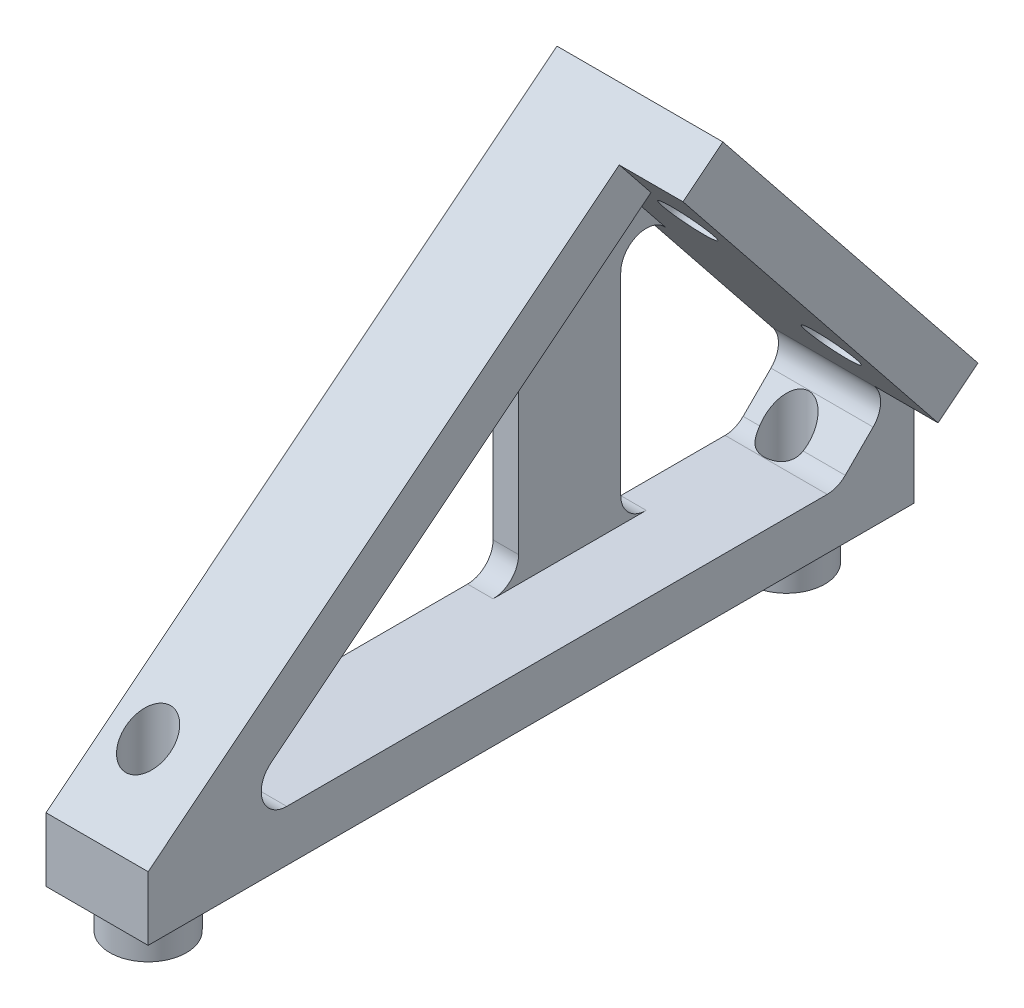
ISO-10303-21;
HEADER;
FILE_DESCRIPTION(('STEP AP214'),'2;1');
FILE_NAME('part.step','',(''),(''),'','','');
FILE_SCHEMA(('AUTOMOTIVE_DESIGN { 1 0 10303 214 1 1 1 1 }'));
ENDSEC;
DATA;
#1=APPLICATION_CONTEXT('core data for automotive mechanical design processes');
#2=APPLICATION_PROTOCOL_DEFINITION('international standard','automotive_design',2000,#1);
#3=PRODUCT_CONTEXT('',#1,'mechanical');
#4=PRODUCT('Part','Part','',(#3));
#5=PRODUCT_RELATED_PRODUCT_CATEGORY('part','',(#4));
#6=PRODUCT_DEFINITION_FORMATION('','',#4);
#7=PRODUCT_DEFINITION_CONTEXT('part definition',#1,'design');
#8=PRODUCT_DEFINITION('design','',#6,#7);
#9=PRODUCT_DEFINITION_SHAPE('','',#8);
#10=(LENGTH_UNIT() NAMED_UNIT(*) SI_UNIT(.MILLI.,.METRE.));
#11=(NAMED_UNIT(*) PLANE_ANGLE_UNIT() SI_UNIT($,.RADIAN.));
#12=(NAMED_UNIT(*) SI_UNIT($,.STERADIAN.) SOLID_ANGLE_UNIT());
#13=UNCERTAINTY_MEASURE_WITH_UNIT(LENGTH_MEASURE(1.E-05),#10,'distance_accuracy_value','');
#14=(GEOMETRIC_REPRESENTATION_CONTEXT(3) GLOBAL_UNCERTAINTY_ASSIGNED_CONTEXT((#13)) GLOBAL_UNIT_ASSIGNED_CONTEXT((#10,
#11,#12)) REPRESENTATION_CONTEXT('',''));
#15=CARTESIAN_POINT('',(0.,0.,0.));
#16=DIRECTION('',(0.,0.,1.));
#17=DIRECTION('',(1.,0.,0.));
#18=AXIS2_PLACEMENT_3D('',#15,#16,#17);
#19=CARTESIAN_POINT('',(13.,4.99999999999999,60.));
#20=DIRECTION('',(0.,-0.781059257272644,-0.624456913348475));
#21=DIRECTION('',(0.,0.624456913348475,-0.781059257272644));
#22=AXIS2_PLACEMENT_3D('',#19,#20,#21);
#23=PLANE('',#22);
#24=CARTESIAN_POINT('',(-10.,8.99750023787564,55.));
#25=DIRECTION('',(0.,-0.781059257272644,-0.624456913348475));
#26=DIRECTION('',(0.,-0.624456913348475,0.781059257272644));
#27=AXIS2_PLACEMENT_3D('',#24,#25,#26);
#28=ELLIPSE('',#27,2.2405470311059,1.75);
#29=CARTESIAN_POINT('',(-10.,7.59837515461916,56.75));
#30=VERTEX_POINT('',#29);
#31=EDGE_CURVE('E497',#30,#30,#28,.T.);
#32=ORIENTED_EDGE('',*,*,#31,.T.);
#33=EDGE_LOOP('',(#32));
#34=FACE_BOUND('',#33,.T.);
#35=DIRECTION('',(0.,-0.624456913348475,0.781059257272644));
#36=VECTOR('',#35,1.);
#37=CARTESIAN_POINT('',(0.,4.99999999999999,60.));
#38=LINE('',#37,#36);
#39=CARTESIAN_POINT('',(0.,36.9938962327247,19.9826212271511));
#40=VERTEX_POINT('',#39);
#41=CARTESIAN_POINT('',(0.,34.4960685793308,23.1068582562417));
#42=VERTEX_POINT('',#41);
#43=EDGE_CURVE('E56',#40,#42,#38,.T.);
#44=ORIENTED_EDGE('',*,*,#43,.F.);
#45=DIRECTION('',(-1.,0.,0.));
#46=VECTOR('',#45,1.);
#47=CARTESIAN_POINT('',(13.,36.9938962327247,19.9826212271511));
#48=LINE('',#47,#46);
#49=CARTESIAN_POINT('',(-13.,36.9938962327247,19.9826212271511));
#50=VERTEX_POINT('',#49);
#51=EDGE_CURVE('E212',#40,#50,#48,.T.);
#52=ORIENTED_EDGE('',*,*,#51,.T.);
#53=DIRECTION('',(0.,-0.624456913348475,0.781059257272644));
#54=VECTOR('',#53,1.);
#55=CARTESIAN_POINT('',(-13.,4.99999999999999,60.));
#56=LINE('',#55,#54);
#57=CARTESIAN_POINT('',(-13.,4.99999999999999,60.));
#58=VERTEX_POINT('',#57);
#59=EDGE_CURVE('E454',#50,#58,#56,.T.);
#60=ORIENTED_EDGE('',*,*,#59,.T.);
#61=DIRECTION('',(1.,0.,0.));
#62=VECTOR('',#61,1.);
#63=CARTESIAN_POINT('',(-13.,4.99999999999999,60.));
#64=LINE('',#63,#62);
#65=CARTESIAN_POINT('',(-5.,5.00000000000001,60.));
#66=VERTEX_POINT('',#65);
#67=EDGE_CURVE('E461',#58,#66,#64,.T.);
#68=ORIENTED_EDGE('',*,*,#67,.T.);
#69=DIRECTION('',(0.,0.624456913348475,-0.781059257272644));
#70=VECTOR('',#69,1.);
#71=CARTESIAN_POINT('',(-5.,34.4960685793308,23.1068582562417));
#72=LINE('',#71,#70);
#73=CARTESIAN_POINT('',(-5.,34.4960685793308,23.1068582562417));
#74=VERTEX_POINT('',#73);
#75=EDGE_CURVE('E432',#66,#74,#72,.T.);
#76=ORIENTED_EDGE('',*,*,#75,.T.);
#77=DIRECTION('',(-1.,0.,0.));
#78=VECTOR('',#77,1.);
#79=CARTESIAN_POINT('',(0.,34.4960685793308,23.1068582562417));
#80=LINE('',#79,#78);
#81=EDGE_CURVE('E36',#42,#74,#80,.T.);
#82=ORIENTED_EDGE('',*,*,#81,.F.);
#83=EDGE_LOOP('',(#44,#52,#60,#68,#76,#82));
#84=FACE_BOUND('',#83,.T.);
#85=ADVANCED_FACE('F32',(#34,#84),#23,.F.);
#86=CARTESIAN_POINT('',(0.,2.18152958615062,-2.72861720617425));
#87=DIRECTION('',(0.,0.624456913348475,-0.781059257272644));
#88=DIRECTION('',(0.,0.781059257272645,0.624456913348475));
#89=AXIS2_PLACEMENT_3D('',#86,#87,#88);
#90=PLANE('',#89);
#91=CARTESIAN_POINT('',(-4.,29.0286537784223,18.7356598628024));
#92=DIRECTION('',(0.,0.624456913348475,-0.781059257272644));
#93=DIRECTION('',(0.,0.781059257272645,0.624456913348475));
#94=AXIS2_PLACEMENT_3D('',#91,#92,#93);
#95=CIRCLE('',#94,2.);
#96=CARTESIAN_POINT('',(-4.,30.5907722929676,19.9845736894993));
#97=VERTEX_POINT('',#96);
#98=EDGE_CURVE('E528',#97,#97,#95,.F.);
#99=ORIENTED_EDGE('',*,*,#98,.F.);
#100=EDGE_LOOP('',(#99));
#101=FACE_BOUND('',#100,.T.);
#102=CARTESIAN_POINT('',(-4.,14.9695871475147,7.49543542252983));
#103=DIRECTION('',(0.,0.624456913348475,-0.781059257272644));
#104=DIRECTION('',(0.,0.781059257272645,0.624456913348475));
#105=AXIS2_PLACEMENT_3D('',#102,#103,#104);
#106=CIRCLE('',#105,2.);
#107=CARTESIAN_POINT('',(-4.,16.53170566206,8.74434924922678));
#108=VERTEX_POINT('',#107);
#109=EDGE_CURVE('E522',#108,#108,#106,.F.);
#110=ORIENTED_EDGE('',*,*,#109,.F.);
#111=EDGE_LOOP('',(#110));
#112=FACE_BOUND('',#111,.T.);
#113=DIRECTION('',(0.,-0.781059257272645,-0.624456913348475));
#114=VECTOR('',#113,1.);
#115=CARTESIAN_POINT('',(0.,2.18152958615062,-2.72861720617425));
#116=LINE('',#115,#114);
#117=CARTESIAN_POINT('',(0.,9.50217234660617,3.12423702909049));
#118=VERTEX_POINT('',#117);
#119=EDGE_CURVE('E49',#42,#118,#116,.T.);
#120=ORIENTED_EDGE('',*,*,#119,.F.);
#121=ORIENTED_EDGE('',*,*,#81,.T.);
#122=DIRECTION('',(0.,0.781059257272644,0.624456913348475));
#123=VECTOR('',#122,1.);
#124=CARTESIAN_POINT('',(-5.,-0.258684667334565,-4.67956861792917));
#125=LINE('',#124,#123);
#126=CARTESIAN_POINT('',(-5.,31.3718315502402,20.6090306028478));
#127=VERTEX_POINT('',#126);
#128=EDGE_CURVE('E435',#127,#74,#125,.T.);
#129=ORIENTED_EDGE('',*,*,#128,.F.);
#130=DIRECTION('',(1.,0.,0.));
#131=VECTOR('',#130,1.);
#132=CARTESIAN_POINT('',(-11.,31.3718315502402,20.6090306028478));
#133=LINE('',#132,#131);
#134=CARTESIAN_POINT('',(-11.,31.3718315502402,20.6090306028478));
#135=VERTEX_POINT('',#134);
#136=EDGE_CURVE('E378',#135,#127,#133,.T.);
#137=ORIENTED_EDGE('',*,*,#136,.F.);
#138=DIRECTION('',(0.,-0.781059257272645,-0.624456913348475));
#139=VECTOR('',#138,1.);
#140=CARTESIAN_POINT('',(-11.,31.3718315502402,20.6090306028478));
#141=LINE('',#140,#139);
#142=CARTESIAN_POINT('',(-11.,22.380552672841,13.4205027126058));
#143=VERTEX_POINT('',#142);
#144=EDGE_CURVE('E408',#135,#143,#141,.T.);
#145=ORIENTED_EDGE('',*,*,#144,.T.);
#146=DIRECTION('',(-1.,0.,0.));
#147=VECTOR('',#146,1.);
#148=CARTESIAN_POINT('',(0.,22.380552672841,13.4205027126058));
#149=LINE('',#148,#147);
#150=CARTESIAN_POINT('',(-13.,22.3805526728409,13.4205027126059));
#151=VERTEX_POINT('',#150);
#152=EDGE_CURVE('E358',#143,#151,#149,.T.);
#153=ORIENTED_EDGE('',*,*,#152,.T.);
#154=DIRECTION('',(0.,0.781059257272647,0.624456913348473));
#155=VECTOR('',#154,1.);
#156=CARTESIAN_POINT('',(-13.,26.83598519639,16.9826212271511));
#157=LINE('',#156,#155);
#158=CARTESIAN_POINT('',(-13.,9.4307271072348,3.0671165568142));
#159=VERTEX_POINT('',#158);
#160=EDGE_CURVE('E405',#159,#151,#157,.T.);
#161=ORIENTED_EDGE('',*,*,#160,.F.);
#162=DIRECTION('',(-1.,0.,0.));
#163=VECTOR('',#162,1.);
#164=CARTESIAN_POINT('',(0.,9.43072710723487,3.06711655681412));
#165=LINE('',#164,#163);
#166=CARTESIAN_POINT('',(-5.,9.43072710723487,3.06711655681412));
#167=VERTEX_POINT('',#166);
#168=EDGE_CURVE('E355',#159,#167,#165,.F.);
#169=ORIENTED_EDGE('',*,*,#168,.T.);
#170=DIRECTION('',(0.,0.781059257272644,0.624456913348475));
#171=VECTOR('',#170,1.);
#172=CARTESIAN_POINT('',(-5.,9.50217234660617,3.12423702909049));
#173=LINE('',#172,#171);
#174=CARTESIAN_POINT('',(-5.,9.50217234660617,3.12423702909049));
#175=VERTEX_POINT('',#174);
#176=EDGE_CURVE('E531',#167,#175,#173,.T.);
#177=ORIENTED_EDGE('',*,*,#176,.T.);
#178=DIRECTION('',(-1.,0.,0.));
#179=VECTOR('',#178,1.);
#180=CARTESIAN_POINT('',(0.,9.50217234660617,3.12423702909049));
#181=LINE('',#180,#179);
#182=EDGE_CURVE('E206',#118,#175,#181,.T.);
#183=ORIENTED_EDGE('',*,*,#182,.F.);
#184=EDGE_LOOP('',(#120,#121,#129,#137,#145,#153,#161,#169,#177,#183));
#185=FACE_BOUND('',#184,.T.);
#186=ADVANCED_FACE('F244',(#101,#112,#185),#90,.F.);
#187=CARTESIAN_POINT('',(13.,36.9938962327247,19.9826212271511));
#188=DIRECTION('',(0.,-0.624456913348472,0.781059257272647));
#189=DIRECTION('',(0.,-0.781059257272647,-0.624456913348472));
#190=AXIS2_PLACEMENT_3D('',#187,#188,#189);
#191=PLANE('',#190);
#192=CARTESIAN_POINT('',(-4.,17.4674148009085,4.37119839343931));
#193=DIRECTION('',(0.,-0.624456913348472,0.781059257272647));
#194=DIRECTION('',(0.,0.781059257272647,0.624456913348472));
#195=AXIS2_PLACEMENT_3D('',#192,#193,#194);
#196=CIRCLE('',#195,2.);
#197=CARTESIAN_POINT('',(-4.,19.0295333154538,5.62011222013625));
#198=VERTEX_POINT('',#197);
#199=EDGE_CURVE('E519',#198,#198,#196,.T.);
#200=ORIENTED_EDGE('',*,*,#199,.T.);
#201=EDGE_LOOP('',(#200));
#202=FACE_BOUND('',#201,.T.);
#203=CARTESIAN_POINT('',(-4.,31.5264814318162,15.6114228337118));
#204=DIRECTION('',(0.,-0.624456913348472,0.781059257272647));
#205=DIRECTION('',(0.,0.781059257272647,0.624456913348472));
#206=AXIS2_PLACEMENT_3D('',#203,#204,#205);
#207=CIRCLE('',#206,2.);
#208=CARTESIAN_POINT('',(-4.,33.0885999463615,16.8603366604088));
#209=VERTEX_POINT('',#208);
#210=EDGE_CURVE('E525',#209,#209,#207,.T.);
#211=ORIENTED_EDGE('',*,*,#210,.T.);
#212=EDGE_LOOP('',(#211));
#213=FACE_BOUND('',#212,.T.);
#214=DIRECTION('',(0.,0.781059257272647,0.624456913348472));
#215=VECTOR('',#214,1.);
#216=CARTESIAN_POINT('',(0.,36.9938962327247,19.9826212271511));
#217=LINE('',#216,#215);
#218=CARTESIAN_POINT('',(0.,12.,0.));
#219=VERTEX_POINT('',#218);
#220=EDGE_CURVE('E209',#219,#40,#217,.T.);
#221=ORIENTED_EDGE('',*,*,#220,.F.);
#222=DIRECTION('',(-1.,0.,0.));
#223=VECTOR('',#222,1.);
#224=CARTESIAN_POINT('',(13.,12.,0.));
#225=LINE('',#224,#223);
#226=CARTESIAN_POINT('',(-5.,12.,0.));
#227=VERTEX_POINT('',#226);
#228=EDGE_CURVE('E198',#219,#227,#225,.T.);
#229=ORIENTED_EDGE('',*,*,#228,.T.);
#230=DIRECTION('',(1.,0.,0.));
#231=VECTOR('',#230,1.);
#232=CARTESIAN_POINT('',(-13.,12.,0.));
#233=LINE('',#232,#231);
#234=CARTESIAN_POINT('',(-13.,12.,0.));
#235=VERTEX_POINT('',#234);
#236=EDGE_CURVE('E459',#235,#227,#233,.T.);
#237=ORIENTED_EDGE('',*,*,#236,.F.);
#238=DIRECTION('',(0.,0.781059257272647,0.624456913348473));
#239=VECTOR('',#238,1.);
#240=CARTESIAN_POINT('',(-13.,36.9938962327247,19.9826212271511));
#241=LINE('',#240,#239);
#242=EDGE_CURVE('E457',#235,#50,#241,.T.);
#243=ORIENTED_EDGE('',*,*,#242,.T.);
#244=ORIENTED_EDGE('',*,*,#51,.F.);
#245=EDGE_LOOP('',(#221,#229,#237,#243,#244));
#246=FACE_BOUND('',#245,.T.);
#247=ADVANCED_FACE('F210',(#202,#213,#246),#191,.F.);
#248=CARTESIAN_POINT('',(0.,17.6201122201363,-7.02953331545388));
#249=DIRECTION('',(0.,0.781059257272644,0.624456913348475));
#250=DIRECTION('',(0.,-0.624456913348475,0.781059257272645));
#251=AXIS2_PLACEMENT_3D('',#248,#249,#250);
#252=PLANE('',#251);
#253=DIRECTION('',(0.,0.624456913348475,-0.781059257272645));
#254=VECTOR('',#253,1.);
#255=CARTESIAN_POINT('',(0.,17.6201122201363,-7.02953331545388));
#256=LINE('',#255,#254);
#257=EDGE_CURVE('E11',#118,#219,#256,.T.);
#258=ORIENTED_EDGE('',*,*,#257,.F.);
#259=ORIENTED_EDGE('',*,*,#182,.T.);
#260=DIRECTION('',(0.,-0.624456913348475,0.781059257272644));
#261=VECTOR('',#260,1.);
#262=CARTESIAN_POINT('',(-5.,17.6201122201363,-7.02953331545388));
#263=LINE('',#262,#261);
#264=EDGE_CURVE('E202',#227,#175,#263,.T.);
#265=ORIENTED_EDGE('',*,*,#264,.F.);
#266=ORIENTED_EDGE('',*,*,#228,.F.);
#267=EDGE_LOOP('',(#258,#259,#265,#266));
#268=FACE_BOUND('',#267,.T.);
#269=ADVANCED_FACE('F200',(#268),#252,.F.);
#270=CARTESIAN_POINT('',(13.,8.03299308645098,1.94962814070017));
#271=DIRECTION('',(0.,0.707106781186546,0.707106781186549));
#272=DIRECTION('',(0.,-0.707106781186549,0.707106781186546));
#273=AXIS2_PLACEMENT_3D('',#270,#271,#272);
#274=PLANE('',#273);
#275=DIRECTION('',(-1.,0.,0.));
#276=VECTOR('',#275,1.);
#277=CARTESIAN_POINT('',(-4.99999999999999,4.58578643762691,5.39683478952422));
#278=LINE('',#277,#276);
#279=CARTESIAN_POINT('',(-13.,4.58578643762691,5.39683478952422));
#280=VERTEX_POINT('',#279);
#281=CARTESIAN_POINT('',(-11.7044125527064,4.58578643762691,5.39683478952422));
#282=VERTEX_POINT('',#281);
#283=EDGE_CURVE('E398',#280,#282,#278,.F.);
#284=ORIENTED_EDGE('',*,*,#283,.T.);
#285=CARTESIAN_POINT('',(-10.,4.98262122715113,5.));
#286=DIRECTION('',(0.,0.707106781186546,0.707106781186549));
#287=DIRECTION('',(0.,-0.707106781186549,0.707106781186546));
#288=AXIS2_PLACEMENT_3D('',#285,#286,#287);
#289=ELLIPSE('',#288,2.47487373415292,1.75);
#290=CARTESIAN_POINT('',(-8.29558744729356,4.58578643762691,5.39683478952422));
#291=VERTEX_POINT('',#290);
#292=EDGE_CURVE('E230',#291,#282,#289,.T.);
#293=ORIENTED_EDGE('',*,*,#292,.F.);
#294=CARTESIAN_POINT('',(-5.,4.5857864376269,5.39683478952422));
#295=VERTEX_POINT('',#294);
#296=EDGE_CURVE('E397',#291,#295,#278,.F.);
#297=ORIENTED_EDGE('',*,*,#296,.T.);
#298=DIRECTION('',(0.,-0.707106781186549,0.707106781186546));
#299=VECTOR('',#298,1.);
#300=CARTESIAN_POINT('',(-5.,7.20175258887286,2.78086863827828));
#301=LINE('',#300,#299);
#302=CARTESIAN_POINT('',(-5.,6.76759971816483,3.21502150898631));
#303=VERTEX_POINT('',#302);
#304=EDGE_CURVE('E426',#303,#295,#301,.T.);
#305=ORIENTED_EDGE('',*,*,#304,.F.);
#306=DIRECTION('',(-1.,0.,0.));
#307=VECTOR('',#306,1.);
#308=CARTESIAN_POINT('',(13.,6.76759971816483,3.21502150898631));
#309=LINE('',#308,#307);
#310=CARTESIAN_POINT('',(-13.,6.76759971816483,3.21502150898631));
#311=VERTEX_POINT('',#310);
#312=EDGE_CURVE('E395',#303,#311,#309,.T.);
#313=ORIENTED_EDGE('',*,*,#312,.T.);
#314=DIRECTION('',(0.,0.707106781186549,-0.707106781186546));
#315=VECTOR('',#314,1.);
#316=CARTESIAN_POINT('',(-13.,8.03299308645098,1.94962814070017));
#317=LINE('',#316,#315);
#318=EDGE_CURVE('E416',#280,#311,#317,.T.);
#319=ORIENTED_EDGE('',*,*,#318,.F.);
#320=EDGE_LOOP('',(#284,#293,#297,#305,#313,#319));
#321=FACE_BOUND('',#320,.T.);
#322=ADVANCED_FACE('F268',(#321),#274,.T.);
#323=CARTESIAN_POINT('',(13.,6.,6.81104835189732));
#324=DIRECTION('',(1.,0.,0.));
#325=DIRECTION('',(0.,0.,-1.));
#326=AXIS2_PLACEMENT_3D('',#323,#324,#325);
#327=CYLINDRICAL_SURFACE('',#326,2.);
#328=CARTESIAN_POINT('',(-8.29558744729357,4.58578643762691,5.39683478952422));
#329=CARTESIAN_POINT('',(-8.30237430661895,4.55661164101087,5.42599705669401));
#330=CARTESIAN_POINT('',(-8.3101440629872,4.52845966389894,5.45596614788278));
#331=CARTESIAN_POINT('',(-8.32787552856729,4.47433109511321,5.51721818331431));
#332=CARTESIAN_POINT('',(-8.33783831463283,4.44835558083984,5.54850176689102));
#333=CARTESIAN_POINT('',(-8.36016681592867,4.39875853940089,5.61202823481423));
#334=CARTESIAN_POINT('',(-8.37253060142761,4.37513514470266,5.64427033127639));
#335=CARTESIAN_POINT('',(-8.39981640747604,4.33032974414087,5.70933824163843));
#336=CARTESIAN_POINT('',(-8.41473788274471,4.30914721950792,5.74216392978662));
#337=CARTESIAN_POINT('',(-8.46366343810198,4.24920551613658,5.84117450638119));
#338=CARTESIAN_POINT('',(-8.5017648877464,4.21419863484478,5.90770197395347));
#339=CARTESIAN_POINT('',(-8.58881665444742,4.15409460210094,6.03787871822795));
#340=CARTESIAN_POINT('',(-8.63775426314733,4.12898593740894,6.10153126213987));
#341=CARTESIAN_POINT('',(-8.74350216882849,4.08815296061411,6.2205780117613));
#342=CARTESIAN_POINT('',(-8.79993935512042,4.07210618746498,6.27619508249403));
#343=CARTESIAN_POINT('',(-8.92071426895098,4.04630316306184,6.37985087354596));
#344=CARTESIAN_POINT('',(-8.98505987372308,4.03655324527456,6.42788192718351));
#345=CARTESIAN_POINT('',(-9.12539899545928,4.02097542416735,6.5182466957784));
#346=CARTESIAN_POINT('',(-9.20191023039846,4.01551502546302,6.5598382946514));
#347=CARTESIAN_POINT('',(-9.36037561583532,4.00777493030205,6.63123958206263));
#348=CARTESIAN_POINT('',(-9.44233073979469,4.00549580432478,6.66104715675276));
#349=CARTESIAN_POINT('',(-9.6178850594171,4.00236214374439,6.71043248567003));
#350=CARTESIAN_POINT('',(-9.71184493469937,4.00166621061397,6.72874630428118));
#351=CARTESIAN_POINT('',(-9.90150386421469,4.00090934014657,6.74983111347046));
#352=CARTESIAN_POINT('',(-9.99720331661837,4.00084855006807,6.75259849952597));
#353=CARTESIAN_POINT('',(-10.1905736334854,4.00117239752009,6.74236178764073));
#354=CARTESIAN_POINT('',(-10.2882203406967,4.00157010890668,6.72889425138387));
#355=CARTESIAN_POINT('',(-10.4798903724145,4.00381147719963,6.68578083318795));
#356=CARTESIAN_POINT('',(-10.5739126767126,4.00565553815566,6.65613043113606));
#357=CARTESIAN_POINT('',(-10.7554011556405,4.01285407123008,6.58160408215308));
#358=CARTESIAN_POINT('',(-10.8428789217916,4.01820216481544,6.53675587189106));
#359=CARTESIAN_POINT('',(-11.0086706078456,4.0352854927421,6.43338963967299));
#360=CARTESIAN_POINT('',(-11.0869896554785,4.04701713209913,6.37487932230388));
#361=CARTESIAN_POINT('',(-11.2278417104107,4.07920223994795,6.25030319701732));
#362=CARTESIAN_POINT('',(-11.2909991178695,4.09915006694277,6.18481663134901));
#363=CARTESIAN_POINT('',(-11.4046938469738,4.1500483356948,6.04750043384971));
#364=CARTESIAN_POINT('',(-11.4552441288865,4.18098739832291,5.97567741967651));
#365=CARTESIAN_POINT('',(-11.53813317093,4.25109451652499,5.83809514862751));
#366=CARTESIAN_POINT('',(-11.57184985816,4.28901153252487,5.77251965955042));
#367=CARTESIAN_POINT('',(-11.6290273104079,4.37450943219301,5.643243510485));
#368=CARTESIAN_POINT('',(-11.6524927648322,4.42208588255184,5.57954200571047));
#369=CARTESIAN_POINT('',(-11.6779672045548,4.49166018617022,5.49740148567358));
#370=CARTESIAN_POINT('',(-11.683922400573,4.50984102509373,5.47681110283486));
#371=CARTESIAN_POINT('',(-11.6948656237311,4.54712393823292,5.43631074064641));
#372=CARTESIAN_POINT('',(-11.6998559577048,4.56622367533618,5.41639923458721));
#373=CARTESIAN_POINT('',(-11.7044125527064,4.58578643762691,5.39683478952422));
#374=B_SPLINE_CURVE_WITH_KNOTS('',3,(#328,#329,#330,#331,#332,#333,#334,#335,#336,#337,#338,
#339,#340,#341,#342,#343,#344,#345,#346,#347,#348,#349,#350,#351,#352,#353,#354,#355,#356,#357,
#358,#359,#360,#361,#362,#363,#364,#365,#366,#367,#368,#369,#370,#371,#372,#373),.UNSPECIFIED.,
.F.,.F.,(4,2,2,2,2,2,2,2,2,2,2,2,2,2,2,2,2,2,2,2,2,2,4),(0.,0.125396432739094,0.250854577382539,
0.376212303030099,0.501543336488006,0.752942043441446,1.00404746375401,1.24553985443084,
1.48727476485899,1.74796569356466,2.0087033644733,2.2945888804682,2.58054067779743,
2.8748521635297,3.16924589689674,3.4631052167421,3.75679921656898,4.03462041417903,
4.31215482017106,4.55968880583115,4.80710943867913,4.89140152674465,4.97548952366149),.UNSPECIFIED.);
#375=EDGE_CURVE('E222',#291,#282,#374,.T.);
#376=ORIENTED_EDGE('',*,*,#375,.T.);
#377=ORIENTED_EDGE('',*,*,#283,.F.);
#378=CARTESIAN_POINT('',(-13.,6.,6.81104835189732));
#379=DIRECTION('',(1.,0.,0.));
#380=DIRECTION('',(0.,0.,-1.));
#381=AXIS2_PLACEMENT_3D('',#378,#379,#380);
#382=CIRCLE('',#381,2.);
#383=CARTESIAN_POINT('',(-13.,4.,6.81104835189732));
#384=VERTEX_POINT('',#383);
#385=EDGE_CURVE('E314',#384,#280,#382,.T.);
#386=ORIENTED_EDGE('',*,*,#385,.F.);
#387=DIRECTION('',(-1.,0.,0.));
#388=VECTOR('',#387,1.);
#389=CARTESIAN_POINT('',(-13.,4.,6.81104835189732));
#390=LINE('',#389,#388);
#391=CARTESIAN_POINT('',(-5.,4.,6.81104835189732));
#392=VERTEX_POINT('',#391);
#393=EDGE_CURVE('E390',#392,#384,#390,.T.);
#394=ORIENTED_EDGE('',*,*,#393,.F.);
#395=CARTESIAN_POINT('',(-5.,6.,6.81104835189732));
#396=DIRECTION('',(1.,0.,0.));
#397=DIRECTION('',(0.,0.,-1.));
#398=AXIS2_PLACEMENT_3D('',#395,#396,#397);
#399=CIRCLE('',#398,2.);
#400=EDGE_CURVE('E321',#295,#392,#399,.F.);
#401=ORIENTED_EDGE('',*,*,#400,.F.);
#402=ORIENTED_EDGE('',*,*,#296,.F.);
#403=EDGE_LOOP('',(#376,#377,#386,#394,#401,#402));
#404=FACE_BOUND('',#403,.T.);
#405=ADVANCED_FACE('F264',(#404),#327,.F.);
#406=CARTESIAN_POINT('',(-10.,-4.,5.));
#407=DIRECTION('',(0.,-1.,0.));
#408=DIRECTION('',(0.,0.,-1.));
#409=AXIS2_PLACEMENT_3D('',#406,#407,#408);
#410=PLANE('',#409);
#411=CARTESIAN_POINT('',(-10.,-4.,5.));
#412=DIRECTION('',(0.,1.,0.));
#413=DIRECTION('',(0.,0.,-1.));
#414=AXIS2_PLACEMENT_3D('',#411,#412,#413);
#415=CIRCLE('',#414,3.);
#416=CARTESIAN_POINT('',(-10.,-4.,2.));
#417=VERTEX_POINT('',#416);
#418=EDGE_CURVE('E491',#417,#417,#415,.T.);
#419=ORIENTED_EDGE('',*,*,#418,.F.);
#420=EDGE_LOOP('',(#419));
#421=FACE_BOUND('',#420,.T.);
#422=CARTESIAN_POINT('',(-10.,-4.,5.));
#423=DIRECTION('',(0.,1.,0.));
#424=DIRECTION('',(0.,0.,-1.));
#425=AXIS2_PLACEMENT_3D('',#422,#423,#424);
#426=CIRCLE('',#425,1.75);
#427=CARTESIAN_POINT('',(-10.,-4.,3.25));
#428=VERTEX_POINT('',#427);
#429=EDGE_CURVE('E217',#428,#428,#426,.T.);
#430=ORIENTED_EDGE('',*,*,#429,.T.);
#431=EDGE_LOOP('',(#430));
#432=FACE_BOUND('',#431,.T.);
#433=ADVANCED_FACE('F267',(#421,#432),#410,.T.);
#434=CARTESIAN_POINT('',(-10.,-4.00000000000001,55.));
#435=DIRECTION('',(0.,-1.,0.));
#436=DIRECTION('',(0.,0.,-1.));
#437=AXIS2_PLACEMENT_3D('',#434,#435,#436);
#438=PLANE('',#437);
#439=CARTESIAN_POINT('',(-10.,-4.00000000000001,55.));
#440=DIRECTION('',(0.,1.,0.));
#441=DIRECTION('',(0.,0.,-1.));
#442=AXIS2_PLACEMENT_3D('',#439,#440,#441);
#443=CIRCLE('',#442,3.);
#444=CARTESIAN_POINT('',(-10.,-4.00000000000001,52.));
#445=VERTEX_POINT('',#444);
#446=EDGE_CURVE('E500',#445,#445,#443,.T.);
#447=ORIENTED_EDGE('',*,*,#446,.F.);
#448=EDGE_LOOP('',(#447));
#449=FACE_BOUND('',#448,.T.);
#450=CARTESIAN_POINT('',(-10.,-4.00000000000001,55.));
#451=DIRECTION('',(0.,1.,0.));
#452=DIRECTION('',(0.,0.,-1.));
#453=AXIS2_PLACEMENT_3D('',#450,#451,#452);
#454=CIRCLE('',#453,1.75);
#455=CARTESIAN_POINT('',(-10.,-4.00000000000001,53.25));
#456=VERTEX_POINT('',#455);
#457=EDGE_CURVE('E492',#456,#456,#454,.T.);
#458=ORIENTED_EDGE('',*,*,#457,.T.);
#459=EDGE_LOOP('',(#458));
#460=FACE_BOUND('',#459,.T.);
#461=ADVANCED_FACE('F572',(#449,#460),#438,.T.);
#462=CARTESIAN_POINT('',(-13.,0.,0.));
#463=DIRECTION('',(0.,-1.,0.));
#464=DIRECTION('',(0.,0.,-1.));
#465=AXIS2_PLACEMENT_3D('',#462,#463,#464);
#466=PLANE('',#465);
#467=DIRECTION('',(0.,0.,-1.));
#468=VECTOR('',#467,1.);
#469=CARTESIAN_POINT('',(-13.,0.,0.));
#470=LINE('',#469,#468);
#471=CARTESIAN_POINT('',(-13.,0.,55.));
#472=VERTEX_POINT('',#471);
#473=CARTESIAN_POINT('',(-13.,0.,5.));
#474=VERTEX_POINT('',#473);
#475=EDGE_CURVE('E451',#472,#474,#470,.T.);
#476=ORIENTED_EDGE('',*,*,#475,.T.);
#477=CARTESIAN_POINT('',(-10.,0.,5.));
#478=DIRECTION('',(0.,1.,0.));
#479=DIRECTION('',(0.,0.,-1.));
#480=AXIS2_PLACEMENT_3D('',#477,#478,#479);
#481=CIRCLE('',#480,3.);
#482=EDGE_CURVE('E489',#474,#474,#481,.T.);
#483=ORIENTED_EDGE('',*,*,#482,.T.);
#484=CARTESIAN_POINT('',(-13.,0.,0.));
#485=VERTEX_POINT('',#484);
#486=EDGE_CURVE('E446',#474,#485,#470,.T.);
#487=ORIENTED_EDGE('',*,*,#486,.T.);
#488=DIRECTION('',(1.,0.,0.));
#489=VECTOR('',#488,1.);
#490=CARTESIAN_POINT('',(-13.,0.,0.));
#491=LINE('',#490,#489);
#492=CARTESIAN_POINT('',(-5.,0.,0.));
#493=VERTEX_POINT('',#492);
#494=EDGE_CURVE('E467',#485,#493,#491,.T.);
#495=ORIENTED_EDGE('',*,*,#494,.T.);
#496=DIRECTION('',(0.,0.,1.));
#497=VECTOR('',#496,1.);
#498=CARTESIAN_POINT('',(-5.,0.,0.));
#499=LINE('',#498,#497);
#500=CARTESIAN_POINT('',(-5.,0.,60.));
#501=VERTEX_POINT('',#500);
#502=EDGE_CURVE('E437',#493,#501,#499,.T.);
#503=ORIENTED_EDGE('',*,*,#502,.T.);
#504=DIRECTION('',(1.,0.,0.));
#505=VECTOR('',#504,1.);
#506=CARTESIAN_POINT('',(-13.,0.,60.));
#507=LINE('',#506,#505);
#508=CARTESIAN_POINT('',(-13.,0.,60.));
#509=VERTEX_POINT('',#508);
#510=EDGE_CURVE('E464',#509,#501,#507,.T.);
#511=ORIENTED_EDGE('',*,*,#510,.F.);
#512=EDGE_CURVE('E447',#509,#472,#470,.T.);
#513=ORIENTED_EDGE('',*,*,#512,.T.);
#514=CARTESIAN_POINT('',(-10.,0.,55.));
#515=DIRECTION('',(0.,1.,0.));
#516=DIRECTION('',(0.,0.,-1.));
#517=AXIS2_PLACEMENT_3D('',#514,#515,#516);
#518=CIRCLE('',#517,3.);
#519=EDGE_CURVE('E484',#472,#472,#518,.T.);
#520=ORIENTED_EDGE('',*,*,#519,.T.);
#521=EDGE_LOOP('',(#476,#483,#487,#495,#503,#511,#513,#520));
#522=FACE_BOUND('',#521,.T.);
#523=ADVANCED_FACE('F483',(#522),#466,.T.);
#524=CARTESIAN_POINT('',(-5.,-0.258684667334565,-4.67956861792917));
#525=DIRECTION('',(1.,0.,0.));
#526=DIRECTION('',(0.,0.,-1.));
#527=AXIS2_PLACEMENT_3D('',#524,#525,#526);
#528=PLANE('',#527);
#529=DIRECTION('',(0.,0.624456913348476,-0.781059257272644));
#530=VECTOR('',#529,1.);
#531=CARTESIAN_POINT('',(-5.,31.3718315502402,20.6090306028478));
#532=LINE('',#531,#530);
#533=CARTESIAN_POINT('',(-5.,7.56211851454527,50.3897830967462));
#534=VERTEX_POINT('',#533);
#535=EDGE_CURVE('E375',#534,#127,#532,.T.);
#536=ORIENTED_EDGE('',*,*,#535,.T.);
#537=ORIENTED_EDGE('',*,*,#128,.T.);
#538=ORIENTED_EDGE('',*,*,#75,.F.);
#539=DIRECTION('',(0.,1.,0.));
#540=VECTOR('',#539,1.);
#541=CARTESIAN_POINT('',(-5.,0.,60.));
#542=LINE('',#541,#540);
#543=EDGE_CURVE('E381',#501,#66,#542,.T.);
#544=ORIENTED_EDGE('',*,*,#543,.F.);
#545=ORIENTED_EDGE('',*,*,#502,.F.);
#546=DIRECTION('',(0.,-1.,0.));
#547=VECTOR('',#546,1.);
#548=CARTESIAN_POINT('',(-5.,12.,0.));
#549=LINE('',#548,#547);
#550=EDGE_CURVE('E440',#227,#493,#549,.T.);
#551=ORIENTED_EDGE('',*,*,#550,.F.);
#552=ORIENTED_EDGE('',*,*,#264,.T.);
#553=ORIENTED_EDGE('',*,*,#176,.F.);
#554=CARTESIAN_POINT('',(-5.,8.18181328053792,4.62923507135941));
#555=DIRECTION('',(1.,0.,0.));
#556=DIRECTION('',(0.,0.,-1.));
#557=AXIS2_PLACEMENT_3D('',#554,#555,#556);
#558=CIRCLE('',#557,2.);
#559=EDGE_CURVE('E325',#167,#303,#558,.F.);
#560=ORIENTED_EDGE('',*,*,#559,.T.);
#561=ORIENTED_EDGE('',*,*,#304,.T.);
#562=ORIENTED_EDGE('',*,*,#400,.T.);
#563=DIRECTION('',(0.,0.,1.));
#564=VECTOR('',#563,1.);
#565=CARTESIAN_POINT('',(-5.,4.,-4.67956861792917));
#566=LINE('',#565,#564);
#567=CARTESIAN_POINT('',(-5.,3.99999999999999,49.1408692700492));
#568=VERTEX_POINT('',#567);
#569=EDGE_CURVE('E351',#392,#568,#566,.T.);
#570=ORIENTED_EDGE('',*,*,#569,.T.);
#571=CARTESIAN_POINT('',(-5.,5.99999999999999,49.1408692700492));
#572=DIRECTION('',(1.,0.,0.));
#573=DIRECTION('',(0.,0.,-1.));
#574=AXIS2_PLACEMENT_3D('',#571,#572,#573);
#575=CIRCLE('',#574,2.);
#576=EDGE_CURVE('E331',#568,#534,#575,.F.);
#577=ORIENTED_EDGE('',*,*,#576,.T.);
#578=EDGE_LOOP('',(#536,#537,#538,#544,#545,#551,#552,#553,#560,#561,#562,#570,#577));
#579=FACE_BOUND('',#578,.T.);
#580=ADVANCED_FACE('F373',(#579),#528,.T.);
#581=CARTESIAN_POINT('',(13.,27.8751456380356,24.9826212271511));
#582=DIRECTION('',(0.,0.,1.));
#583=DIRECTION('',(0.,-1.,0.));
#584=AXIS2_PLACEMENT_3D('',#581,#582,#583);
#585=PLANE('',#584);
#586=DIRECTION('',(-1.,0.,0.));
#587=VECTOR('',#586,1.);
#588=CARTESIAN_POINT('',(-5.,5.99999999999999,24.9826212271511));
#589=LINE('',#588,#587);
#590=CARTESIAN_POINT('',(-13.,6.,24.9826212271511));
#591=VERTEX_POINT('',#590);
#592=CARTESIAN_POINT('',(-11.,5.99999999999999,24.9826212271511));
#593=VERTEX_POINT('',#592);
#594=EDGE_CURVE('E297',#591,#593,#589,.F.);
#595=ORIENTED_EDGE('',*,*,#594,.T.);
#596=DIRECTION('',(0.,1.,0.));
#597=VECTOR('',#596,1.);
#598=CARTESIAN_POINT('',(-11.,27.8751456380356,24.9826212271511));
#599=LINE('',#598,#597);
#600=CARTESIAN_POINT('',(-11.,23.7155203644786,24.9826212271511));
#601=VERTEX_POINT('',#600);
#602=EDGE_CURVE('E307',#593,#601,#599,.T.);
#603=ORIENTED_EDGE('',*,*,#602,.T.);
#604=DIRECTION('',(-1.,0.,0.));
#605=VECTOR('',#604,1.);
#606=CARTESIAN_POINT('',(-13.,23.7155203644786,24.9826212271511));
#607=LINE('',#606,#605);
#608=CARTESIAN_POINT('',(-13.,23.7155203644786,24.9826212271511));
#609=VERTEX_POINT('',#608);
#610=EDGE_CURVE('E312',#601,#609,#607,.T.);
#611=ORIENTED_EDGE('',*,*,#610,.T.);
#612=DIRECTION('',(0.,1.,0.));
#613=VECTOR('',#612,1.);
#614=CARTESIAN_POINT('',(-13.,27.8751456380356,24.9826212271511));
#615=LINE('',#614,#613);
#616=EDGE_CURVE('E310',#591,#609,#615,.T.);
#617=ORIENTED_EDGE('',*,*,#616,.F.);
#618=EDGE_LOOP('',(#595,#603,#611,#617));
#619=FACE_BOUND('',#618,.T.);
#620=ADVANCED_FACE('F306',(#619),#585,.T.);
#621=CARTESIAN_POINT('',(13.,23.7155203644786,26.9826212271511));
#622=DIRECTION('',(1.,0.,0.));
#623=DIRECTION('',(0.,0.,-1.));
#624=AXIS2_PLACEMENT_3D('',#621,#622,#623);
#625=CYLINDRICAL_SURFACE('',#624,2.);
#626=CARTESIAN_POINT('',(-11.,23.7155203644786,26.9826212271511));
#627=DIRECTION('',(1.,0.,0.));
#628=DIRECTION('',(0.,0.,-1.));
#629=AXIS2_PLACEMENT_3D('',#626,#627,#628);
#630=CIRCLE('',#629,2.);
#631=CARTESIAN_POINT('',(-11.,25.2776388790239,28.2315350538481));
#632=VERTEX_POINT('',#631);
#633=EDGE_CURVE('E354',#632,#601,#630,.F.);
#634=ORIENTED_EDGE('',*,*,#633,.F.);
#635=DIRECTION('',(-1.,0.,0.));
#636=VECTOR('',#635,1.);
#637=CARTESIAN_POINT('',(-5.,25.2776388790239,28.2315350538481));
#638=LINE('',#637,#636);
#639=CARTESIAN_POINT('',(-13.,25.2776388790239,28.2315350538481));
#640=VERTEX_POINT('',#639);
#641=EDGE_CURVE('E346',#640,#632,#638,.F.);
#642=ORIENTED_EDGE('',*,*,#641,.F.);
#643=CARTESIAN_POINT('',(-13.,23.7155203644786,26.9826212271511));
#644=DIRECTION('',(1.,0.,0.));
#645=DIRECTION('',(0.,0.,-1.));
#646=AXIS2_PLACEMENT_3D('',#643,#644,#645);
#647=CIRCLE('',#646,2.);
#648=EDGE_CURVE('E301',#609,#640,#647,.T.);
#649=ORIENTED_EDGE('',*,*,#648,.F.);
#650=ORIENTED_EDGE('',*,*,#610,.F.);
#651=EDGE_LOOP('',(#634,#642,#649,#650));
#652=FACE_BOUND('',#651,.T.);
#653=ADVANCED_FACE('F34',(#652),#625,.F.);
#654=CARTESIAN_POINT('',(13.,3.99999999999999,16.9826212271511));
#655=DIRECTION('',(0.,0.,-1.));
#656=DIRECTION('',(-1.,0.,0.));
#657=AXIS2_PLACEMENT_3D('',#654,#655,#656);
#658=PLANE('',#657);
#659=DIRECTION('',(-1.,0.,0.));
#660=VECTOR('',#659,1.);
#661=CARTESIAN_POINT('',(13.,21.131638846144,16.9826212271511));
#662=LINE('',#661,#660);
#663=CARTESIAN_POINT('',(-13.,21.131638846144,16.9826212271511));
#664=VERTEX_POINT('',#663);
#665=CARTESIAN_POINT('',(-11.,21.131638846144,16.9826212271511));
#666=VERTEX_POINT('',#665);
#667=EDGE_CURVE('E380',#664,#666,#662,.F.);
#668=ORIENTED_EDGE('',*,*,#667,.T.);
#669=DIRECTION('',(0.,-1.,0.));
#670=VECTOR('',#669,1.);
#671=CARTESIAN_POINT('',(-11.,3.99999999999999,16.9826212271511));
#672=LINE('',#671,#670);
#673=CARTESIAN_POINT('',(-11.,5.99999999999999,16.9826212271511));
#674=VERTEX_POINT('',#673);
#675=EDGE_CURVE('E514',#666,#674,#672,.T.);
#676=ORIENTED_EDGE('',*,*,#675,.T.);
#677=DIRECTION('',(-1.,0.,0.));
#678=VECTOR('',#677,1.);
#679=CARTESIAN_POINT('',(-13.,5.99999999999999,16.9826212271511));
#680=LINE('',#679,#678);
#681=CARTESIAN_POINT('',(-13.,5.99999999999999,16.9826212271511));
#682=VERTEX_POINT('',#681);
#683=EDGE_CURVE('E384',#674,#682,#680,.T.);
#684=ORIENTED_EDGE('',*,*,#683,.T.);
#685=DIRECTION('',(0.,-1.,0.));
#686=VECTOR('',#685,1.);
#687=CARTESIAN_POINT('',(-13.,3.99999999999999,16.9826212271511));
#688=LINE('',#687,#686);
#689=EDGE_CURVE('E417',#664,#682,#688,.T.);
#690=ORIENTED_EDGE('',*,*,#689,.F.);
#691=EDGE_LOOP('',(#668,#676,#684,#690));
#692=FACE_BOUND('',#691,.T.);
#693=ADVANCED_FACE('F262',(#692),#658,.T.);
#694=CARTESIAN_POINT('',(13.,5.99999999999999,14.9826212271511));
#695=DIRECTION('',(1.,0.,0.));
#696=DIRECTION('',(0.,0.,-1.));
#697=AXIS2_PLACEMENT_3D('',#694,#695,#696);
#698=CYLINDRICAL_SURFACE('',#697,2.);
#699=CARTESIAN_POINT('',(-11.,5.99999999999999,14.9826212271511));
#700=DIRECTION('',(1.,0.,0.));
#701=DIRECTION('',(0.,0.,-1.));
#702=AXIS2_PLACEMENT_3D('',#699,#700,#701);
#703=CIRCLE('',#702,2.);
#704=CARTESIAN_POINT('',(-11.,3.99999999999999,14.9826212271511));
#705=VERTEX_POINT('',#704);
#706=EDGE_CURVE('E517',#705,#674,#703,.F.);
#707=ORIENTED_EDGE('',*,*,#706,.F.);
#708=DIRECTION('',(-1.,0.,0.));
#709=VECTOR('',#708,1.);
#710=CARTESIAN_POINT('',(-5.,3.99999999999999,14.9826212271511));
#711=LINE('',#710,#709);
#712=CARTESIAN_POINT('',(-13.,3.99999999999999,14.9826212271511));
#713=VERTEX_POINT('',#712);
#714=EDGE_CURVE('E392',#713,#705,#711,.F.);
#715=ORIENTED_EDGE('',*,*,#714,.F.);
#716=CARTESIAN_POINT('',(-13.,5.99999999999999,14.9826212271511));
#717=DIRECTION('',(1.,0.,0.));
#718=DIRECTION('',(0.,0.,-1.));
#719=AXIS2_PLACEMENT_3D('',#716,#717,#718);
#720=CIRCLE('',#719,2.);
#721=EDGE_CURVE('E311',#682,#713,#720,.T.);
#722=ORIENTED_EDGE('',*,*,#721,.F.);
#723=ORIENTED_EDGE('',*,*,#683,.F.);
#724=EDGE_LOOP('',(#707,#715,#722,#723));
#725=FACE_BOUND('',#724,.T.);
#726=ADVANCED_FACE('F258',(#725),#698,.F.);
#727=CARTESIAN_POINT('',(0.,21.131638846144,14.9826212271511));
#728=DIRECTION('',(-1.,0.,0.));
#729=DIRECTION('',(0.,0.,1.));
#730=AXIS2_PLACEMENT_3D('',#727,#728,#729);
#731=CYLINDRICAL_SURFACE('',#730,2.);
#732=CARTESIAN_POINT('',(-11.,21.131638846144,14.9826212271511));
#733=DIRECTION('',(1.,0.,0.));
#734=DIRECTION('',(0.,0.,-1.));
#735=AXIS2_PLACEMENT_3D('',#732,#733,#734);
#736=CIRCLE('',#735,2.);
#737=EDGE_CURVE('E512',#666,#143,#736,.F.);
#738=ORIENTED_EDGE('',*,*,#737,.F.);
#739=ORIENTED_EDGE('',*,*,#667,.F.);
#740=CARTESIAN_POINT('',(-13.,21.131638846144,14.9826212271511));
#741=DIRECTION('',(1.,0.,0.));
#742=DIRECTION('',(0.,0.,-1.));
#743=AXIS2_PLACEMENT_3D('',#740,#741,#742);
#744=CIRCLE('',#743,2.);
#745=EDGE_CURVE('E327',#151,#664,#744,.T.);
#746=ORIENTED_EDGE('',*,*,#745,.F.);
#747=ORIENTED_EDGE('',*,*,#152,.F.);
#748=EDGE_LOOP('',(#738,#739,#746,#747));
#749=FACE_BOUND('',#748,.T.);
#750=ADVANCED_FACE('F261',(#749),#731,.F.);
#751=CARTESIAN_POINT('',(13.,5.99999999999999,26.9826212271511));
#752=DIRECTION('',(1.,0.,0.));
#753=DIRECTION('',(0.,0.,-1.));
#754=AXIS2_PLACEMENT_3D('',#751,#752,#753);
#755=CYLINDRICAL_SURFACE('',#754,2.);
#756=CARTESIAN_POINT('',(-11.,5.99999999999999,26.9826212271511));
#757=DIRECTION('',(1.,0.,0.));
#758=DIRECTION('',(0.,0.,-1.));
#759=AXIS2_PLACEMENT_3D('',#756,#757,#758);
#760=CIRCLE('',#759,2.);
#761=CARTESIAN_POINT('',(-11.,3.99999999999999,26.9826212271511));
#762=VERTEX_POINT('',#761);
#763=EDGE_CURVE('E42',#593,#762,#760,.F.);
#764=ORIENTED_EDGE('',*,*,#763,.F.);
#765=ORIENTED_EDGE('',*,*,#594,.F.);
#766=CARTESIAN_POINT('',(-13.,5.99999999999999,26.9826212271511));
#767=DIRECTION('',(1.,0.,0.));
#768=DIRECTION('',(0.,0.,-1.));
#769=AXIS2_PLACEMENT_3D('',#766,#767,#768);
#770=CIRCLE('',#769,2.);
#771=CARTESIAN_POINT('',(-13.,3.99999999999999,26.9826212271511));
#772=VERTEX_POINT('',#771);
#773=EDGE_CURVE('E333',#772,#591,#770,.T.);
#774=ORIENTED_EDGE('',*,*,#773,.F.);
#775=DIRECTION('',(-1.,0.,0.));
#776=VECTOR('',#775,1.);
#777=CARTESIAN_POINT('',(-13.,3.99999999999999,26.9826212271511));
#778=LINE('',#777,#776);
#779=EDGE_CURVE('E298',#762,#772,#778,.T.);
#780=ORIENTED_EDGE('',*,*,#779,.F.);
#781=EDGE_LOOP('',(#764,#765,#774,#780));
#782=FACE_BOUND('',#781,.T.);
#783=ADVANCED_FACE('F278',(#782),#755,.F.);
#784=CARTESIAN_POINT('',(-4.,23.408541558286,25.7651931782562));
#785=DIRECTION('',(0.,0.624456913348472,-0.781059257272647));
#786=DIRECTION('',(0.,0.781059257272647,0.624456913348472));
#787=AXIS2_PLACEMENT_3D('',#784,#785,#786);
#788=CYLINDRICAL_SURFACE('',#787,2.);
#789=ORIENTED_EDGE('',*,*,#210,.F.);
#790=EDGE_LOOP('',(#789));
#791=FACE_BOUND('',#790,.T.);
#792=ORIENTED_EDGE('',*,*,#98,.T.);
#793=EDGE_LOOP('',(#792));
#794=FACE_BOUND('',#793,.T.);
#795=ADVANCED_FACE('F284',(#791,#794),#788,.F.);
#796=CARTESIAN_POINT('',(-13.,12.,0.));
#797=DIRECTION('',(0.,0.,-1.));
#798=DIRECTION('',(0.,1.,0.));
#799=AXIS2_PLACEMENT_3D('',#796,#797,#798);
#800=PLANE('',#799);
#801=ORIENTED_EDGE('',*,*,#236,.T.);
#802=ORIENTED_EDGE('',*,*,#550,.T.);
#803=ORIENTED_EDGE('',*,*,#494,.F.);
#804=DIRECTION('',(0.,1.,0.));
#805=VECTOR('',#804,1.);
#806=CARTESIAN_POINT('',(-13.,12.,0.));
#807=LINE('',#806,#805);
#808=EDGE_CURVE('E443',#485,#235,#807,.T.);
#809=ORIENTED_EDGE('',*,*,#808,.T.);
#810=EDGE_LOOP('',(#801,#802,#803,#809));
#811=FACE_BOUND('',#810,.T.);
#812=ADVANCED_FACE('F289',(#811),#800,.T.);
#813=CARTESIAN_POINT('',(-13.,0.,0.));
#814=DIRECTION('',(1.,0.,0.));
#815=DIRECTION('',(0.,0.,1.));
#816=AXIS2_PLACEMENT_3D('',#813,#814,#815);
#817=PLANE('',#816);
#818=ORIENTED_EDGE('',*,*,#616,.T.);
#819=ORIENTED_EDGE('',*,*,#648,.T.);
#820=DIRECTION('',(0.,-0.624456913348476,0.781059257272644));
#821=VECTOR('',#820,1.);
#822=CARTESIAN_POINT('',(-13.,3.99999999999999,54.8452156202953));
#823=LINE('',#822,#821);
#824=CARTESIAN_POINT('',(-13.,7.56211851454528,50.3897830967462));
#825=VERTEX_POINT('',#824);
#826=EDGE_CURVE('E341',#640,#825,#823,.T.);
#827=ORIENTED_EDGE('',*,*,#826,.T.);
#828=CARTESIAN_POINT('',(-13.,5.99999999999999,49.1408692700492));
#829=DIRECTION('',(1.,0.,0.));
#830=DIRECTION('',(0.,0.,-1.));
#831=AXIS2_PLACEMENT_3D('',#828,#829,#830);
#832=CIRCLE('',#831,2.);
#833=CARTESIAN_POINT('',(-13.,3.99999999999999,49.1408692700492));
#834=VERTEX_POINT('',#833);
#835=EDGE_CURVE('E329',#825,#834,#832,.T.);
#836=ORIENTED_EDGE('',*,*,#835,.T.);
#837=DIRECTION('',(0.,0.,-1.));
#838=VECTOR('',#837,1.);
#839=CARTESIAN_POINT('',(-13.,3.99999999999999,24.9826212271511));
#840=LINE('',#839,#838);
#841=EDGE_CURVE('E371',#834,#772,#840,.T.);
#842=ORIENTED_EDGE('',*,*,#841,.T.);
#843=ORIENTED_EDGE('',*,*,#773,.T.);
#844=EDGE_LOOP('',(#818,#819,#827,#836,#842,#843));
#845=FACE_BOUND('',#844,.T.);
#846=ORIENTED_EDGE('',*,*,#808,.F.);
#847=ORIENTED_EDGE('',*,*,#486,.F.);
#848=ORIENTED_EDGE('',*,*,#475,.F.);
#849=ORIENTED_EDGE('',*,*,#512,.F.);
#850=DIRECTION('',(0.,-1.,0.));
#851=VECTOR('',#850,1.);
#852=CARTESIAN_POINT('',(-13.,0.,60.));
#853=LINE('',#852,#851);
#854=EDGE_CURVE('E450',#58,#509,#853,.T.);
#855=ORIENTED_EDGE('',*,*,#854,.F.);
#856=ORIENTED_EDGE('',*,*,#59,.F.);
#857=ORIENTED_EDGE('',*,*,#242,.F.);
#858=EDGE_LOOP('',(#846,#847,#848,#849,#855,#856,#857));
#859=FACE_BOUND('',#858,.T.);
#860=ORIENTED_EDGE('',*,*,#160,.T.);
#861=ORIENTED_EDGE('',*,*,#745,.T.);
#862=ORIENTED_EDGE('',*,*,#689,.T.);
#863=ORIENTED_EDGE('',*,*,#721,.T.);
#864=DIRECTION('',(0.,0.,-1.));
#865=VECTOR('',#864,1.);
#866=CARTESIAN_POINT('',(-13.,4.,5.98262122715113));
#867=LINE('',#866,#865);
#868=EDGE_CURVE('E419',#713,#384,#867,.T.);
#869=ORIENTED_EDGE('',*,*,#868,.T.);
#870=ORIENTED_EDGE('',*,*,#385,.T.);
#871=ORIENTED_EDGE('',*,*,#318,.T.);
#872=CARTESIAN_POINT('',(-13.,8.18181328053792,4.62923507135941));
#873=DIRECTION('',(1.,0.,0.));
#874=DIRECTION('',(0.,0.,-1.));
#875=AXIS2_PLACEMENT_3D('',#872,#873,#874);
#876=CIRCLE('',#875,2.);
#877=EDGE_CURVE('E323',#311,#159,#876,.T.);
#878=ORIENTED_EDGE('',*,*,#877,.T.);
#879=EDGE_LOOP('',(#860,#861,#862,#863,#869,#870,#871,#878));
#880=FACE_BOUND('',#879,.T.);
#881=ADVANCED_FACE('F339',(#845,#859,#880),#817,.F.);
#882=CARTESIAN_POINT('',(-13.,0.,60.));
#883=DIRECTION('',(0.,0.,1.));
#884=DIRECTION('',(1.,0.,0.));
#885=AXIS2_PLACEMENT_3D('',#882,#883,#884);
#886=PLANE('',#885);
#887=ORIENTED_EDGE('',*,*,#510,.T.);
#888=ORIENTED_EDGE('',*,*,#543,.T.);
#889=ORIENTED_EDGE('',*,*,#67,.F.);
#890=ORIENTED_EDGE('',*,*,#854,.T.);
#891=EDGE_LOOP('',(#887,#888,#889,#890));
#892=FACE_BOUND('',#891,.T.);
#893=ADVANCED_FACE('F475',(#892),#886,.T.);
#894=CARTESIAN_POINT('',(13.,3.99999999999999,24.9826212271511));
#895=DIRECTION('',(0.,1.,0.));
#896=DIRECTION('',(0.,0.,1.));
#897=AXIS2_PLACEMENT_3D('',#894,#895,#896);
#898=PLANE('',#897);
#899=DIRECTION('',(0.,0.,1.));
#900=VECTOR('',#899,1.);
#901=CARTESIAN_POINT('',(-11.,4.,6.81104835189732));
#902=LINE('',#901,#900);
#903=EDGE_CURVE('E503',#705,#762,#902,.T.);
#904=ORIENTED_EDGE('',*,*,#903,.T.);
#905=ORIENTED_EDGE('',*,*,#779,.T.);
#906=ORIENTED_EDGE('',*,*,#841,.F.);
#907=DIRECTION('',(-1.,0.,0.));
#908=VECTOR('',#907,1.);
#909=CARTESIAN_POINT('',(-5.,3.99999999999999,49.1408692700492));
#910=LINE('',#909,#908);
#911=EDGE_CURVE('E316',#834,#568,#910,.F.);
#912=ORIENTED_EDGE('',*,*,#911,.T.);
#913=ORIENTED_EDGE('',*,*,#569,.F.);
#914=ORIENTED_EDGE('',*,*,#393,.T.);
#915=ORIENTED_EDGE('',*,*,#868,.F.);
#916=ORIENTED_EDGE('',*,*,#714,.T.);
#917=EDGE_LOOP('',(#904,#905,#906,#912,#913,#914,#915,#916));
#918=FACE_BOUND('',#917,.T.);
#919=ADVANCED_FACE('F368',(#918),#898,.T.);
#920=CARTESIAN_POINT('',(13.,3.99999999999999,54.8452156202953));
#921=DIRECTION('',(0.,-0.781059257272644,-0.624456913348476));
#922=DIRECTION('',(0.,0.624456913348476,-0.781059257272644));
#923=AXIS2_PLACEMENT_3D('',#920,#921,#922);
#924=PLANE('',#923);
#925=DIRECTION('',(-1.,0.,0.));
#926=VECTOR('',#925,1.);
#927=CARTESIAN_POINT('',(-13.,7.56211851454528,50.3897830967462));
#928=LINE('',#927,#926);
#929=EDGE_CURVE('E349',#534,#825,#928,.T.);
#930=ORIENTED_EDGE('',*,*,#929,.T.);
#931=ORIENTED_EDGE('',*,*,#826,.F.);
#932=ORIENTED_EDGE('',*,*,#641,.T.);
#933=DIRECTION('',(0.,0.624456913348475,-0.781059257272644));
#934=VECTOR('',#933,1.);
#935=CARTESIAN_POINT('',(-11.,31.3718315502402,20.6090306028478));
#936=LINE('',#935,#934);
#937=EDGE_CURVE('E507',#632,#135,#936,.T.);
#938=ORIENTED_EDGE('',*,*,#937,.T.);
#939=ORIENTED_EDGE('',*,*,#136,.T.);
#940=ORIENTED_EDGE('',*,*,#535,.F.);
#941=EDGE_LOOP('',(#930,#931,#932,#938,#939,#940));
#942=FACE_BOUND('',#941,.T.);
#943=ADVANCED_FACE('F274',(#942),#924,.T.);
#944=CARTESIAN_POINT('',(13.,8.18181328053792,4.62923507135941));
#945=DIRECTION('',(-1.,0.,0.));
#946=DIRECTION('',(0.,0.,1.));
#947=AXIS2_PLACEMENT_3D('',#944,#945,#946);
#948=CYLINDRICAL_SURFACE('',#947,2.);
#949=ORIENTED_EDGE('',*,*,#559,.F.);
#950=ORIENTED_EDGE('',*,*,#168,.F.);
#951=ORIENTED_EDGE('',*,*,#877,.F.);
#952=ORIENTED_EDGE('',*,*,#312,.F.);
#953=EDGE_LOOP('',(#949,#950,#951,#952));
#954=FACE_BOUND('',#953,.T.);
#955=ADVANCED_FACE('F270',(#954),#948,.F.);
#956=CARTESIAN_POINT('',(13.,5.99999999999999,49.1408692700492));
#957=DIRECTION('',(1.,0.,0.));
#958=DIRECTION('',(0.,0.,-1.));
#959=AXIS2_PLACEMENT_3D('',#956,#957,#958);
#960=CYLINDRICAL_SURFACE('',#959,2.);
#961=ORIENTED_EDGE('',*,*,#576,.F.);
#962=ORIENTED_EDGE('',*,*,#911,.F.);
#963=ORIENTED_EDGE('',*,*,#835,.F.);
#964=ORIENTED_EDGE('',*,*,#929,.F.);
#965=EDGE_LOOP('',(#961,#962,#963,#964));
#966=FACE_BOUND('',#965,.T.);
#967=ADVANCED_FACE('F273',(#966),#960,.F.);
#968=CARTESIAN_POINT('',(-4.,9.34947492737839,14.5249687379837));
#969=DIRECTION('',(0.,0.624456913348472,-0.781059257272647));
#970=DIRECTION('',(0.,0.781059257272647,0.624456913348472));
#971=AXIS2_PLACEMENT_3D('',#968,#969,#970);
#972=CYLINDRICAL_SURFACE('',#971,2.);
#973=ORIENTED_EDGE('',*,*,#199,.F.);
#974=EDGE_LOOP('',(#973));
#975=FACE_BOUND('',#974,.T.);
#976=ORIENTED_EDGE('',*,*,#109,.T.);
#977=EDGE_LOOP('',(#976));
#978=FACE_BOUND('',#977,.T.);
#979=ADVANCED_FACE('F281',(#975,#978),#972,.F.);
#980=CARTESIAN_POINT('',(-11.,5.99999999999999,49.1408692700492));
#981=DIRECTION('',(1.,0.,0.));
#982=DIRECTION('',(0.,0.,1.));
#983=AXIS2_PLACEMENT_3D('',#980,#981,#982);
#984=PLANE('',#983);
#985=ORIENTED_EDGE('',*,*,#706,.T.);
#986=ORIENTED_EDGE('',*,*,#675,.F.);
#987=ORIENTED_EDGE('',*,*,#737,.T.);
#988=ORIENTED_EDGE('',*,*,#144,.F.);
#989=ORIENTED_EDGE('',*,*,#937,.F.);
#990=ORIENTED_EDGE('',*,*,#633,.T.);
#991=ORIENTED_EDGE('',*,*,#602,.F.);
#992=ORIENTED_EDGE('',*,*,#763,.T.);
#993=ORIENTED_EDGE('',*,*,#903,.F.);
#994=EDGE_LOOP('',(#985,#986,#987,#988,#989,#990,#991,#992,#993));
#995=FACE_BOUND('',#994,.T.);
#996=ADVANCED_FACE('F549',(#995),#984,.T.);
#997=CARTESIAN_POINT('',(-10.,-4.00000000000001,55.));
#998=DIRECTION('',(0.,1.,0.));
#999=DIRECTION('',(0.,0.,1.));
#1000=AXIS2_PLACEMENT_3D('',#997,#998,#999);
#1001=CYLINDRICAL_SURFACE('',#1000,3.);
#1002=ORIENTED_EDGE('',*,*,#446,.T.);
#1003=EDGE_LOOP('',(#1002));
#1004=FACE_BOUND('',#1003,.T.);
#1005=ORIENTED_EDGE('',*,*,#519,.F.);
#1006=EDGE_LOOP('',(#1005));
#1007=FACE_BOUND('',#1006,.T.);
#1008=ADVANCED_FACE('F703',(#1004,#1007),#1001,.T.);
#1009=CARTESIAN_POINT('',(-10.,-4.,5.));
#1010=DIRECTION('',(0.,1.,0.));
#1011=DIRECTION('',(0.,0.,1.));
#1012=AXIS2_PLACEMENT_3D('',#1009,#1010,#1011);
#1013=CYLINDRICAL_SURFACE('',#1012,3.);
#1014=ORIENTED_EDGE('',*,*,#418,.T.);
#1015=EDGE_LOOP('',(#1014));
#1016=FACE_BOUND('',#1015,.T.);
#1017=ORIENTED_EDGE('',*,*,#482,.F.);
#1018=EDGE_LOOP('',(#1017));
#1019=FACE_BOUND('',#1018,.T.);
#1020=ADVANCED_FACE('F712',(#1016,#1019),#1013,.T.);
#1021=CARTESIAN_POINT('',(-10.,36.9948962327247,55.));
#1022=DIRECTION('',(0.,-1.,0.));
#1023=DIRECTION('',(0.,0.,-1.));
#1024=AXIS2_PLACEMENT_3D('',#1021,#1022,#1023);
#1025=CYLINDRICAL_SURFACE('',#1024,1.75);
#1026=ORIENTED_EDGE('',*,*,#457,.F.);
#1027=EDGE_LOOP('',(#1026));
#1028=FACE_BOUND('',#1027,.T.);
#1029=ORIENTED_EDGE('',*,*,#31,.F.);
#1030=EDGE_LOOP('',(#1029));
#1031=FACE_BOUND('',#1030,.T.);
#1032=ADVANCED_FACE('F241',(#1028,#1031),#1025,.F.);
#1033=CARTESIAN_POINT('',(-10.,36.9948962327247,5.));
#1034=DIRECTION('',(0.,-1.,0.));
#1035=DIRECTION('',(0.,0.,-1.));
#1036=AXIS2_PLACEMENT_3D('',#1033,#1034,#1035);
#1037=CYLINDRICAL_SURFACE('',#1036,1.75);
#1038=ORIENTED_EDGE('',*,*,#292,.T.);
#1039=ORIENTED_EDGE('',*,*,#375,.F.);
#1040=EDGE_LOOP('',(#1038,#1039));
#1041=FACE_BOUND('',#1040,.T.);
#1042=ORIENTED_EDGE('',*,*,#429,.F.);
#1043=EDGE_LOOP('',(#1042));
#1044=FACE_BOUND('',#1043,.T.);
#1045=ADVANCED_FACE('F232',(#1041,#1044),#1037,.F.);
#1046=CARTESIAN_POINT('',(0.,102.205185282519,0.));
#1047=DIRECTION('',(1.,0.,0.));
#1048=DIRECTION('',(0.,0.,-1.));
#1049=AXIS2_PLACEMENT_3D('',#1046,#1047,#1048);
#1050=PLANE('',#1049);
#1051=ORIENTED_EDGE('',*,*,#220,.T.);
#1052=ORIENTED_EDGE('',*,*,#43,.T.);
#1053=ORIENTED_EDGE('',*,*,#119,.T.);
#1054=ORIENTED_EDGE('',*,*,#257,.T.);
#1055=EDGE_LOOP('',(#1051,#1052,#1053,#1054));
#1056=FACE_BOUND('',#1055,.T.);
#1057=ADVANCED_FACE('F215',(#1056),#1050,.T.);
#1058=CLOSED_SHELL('',(#85,#186,#247,#269,#322,#405,#433,#461,#523,#580,#620,#653,#693,#726,
#750,#783,#795,#812,#881,#893,#919,#943,#955,#967,#979,#996,#1008,#1020,#1032,#1045,#1057));
#1059=MANIFOLD_SOLID_BREP('B2',#1058);
#1060=ADVANCED_BREP_SHAPE_REPRESENTATION('',(#18,#1059),#14);
#1061=SHAPE_DEFINITION_REPRESENTATION(#9,#1060);
ENDSEC;
END-ISO-10303-21;
